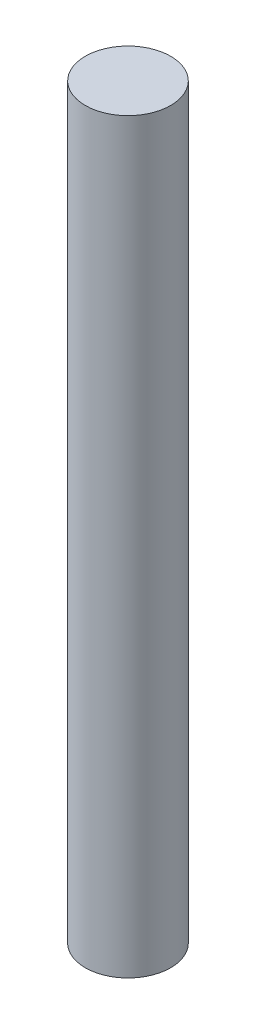
ISO-10303-21;
HEADER;
FILE_DESCRIPTION(('STEP AP214'),'2;1');
FILE_NAME('part.step','',(''),(''),'','','');
FILE_SCHEMA(('AUTOMOTIVE_DESIGN { 1 0 10303 214 1 1 1 1 }'));
ENDSEC;
DATA;
#1=APPLICATION_CONTEXT('core data for automotive mechanical design processes');
#2=APPLICATION_PROTOCOL_DEFINITION('international standard','automotive_design',2000,#1);
#3=PRODUCT_CONTEXT('',#1,'mechanical');
#4=PRODUCT('Part','Part','',(#3));
#5=PRODUCT_RELATED_PRODUCT_CATEGORY('part','',(#4));
#6=PRODUCT_DEFINITION_FORMATION('','',#4);
#7=PRODUCT_DEFINITION_CONTEXT('part definition',#1,'design');
#8=PRODUCT_DEFINITION('design','',#6,#7);
#9=PRODUCT_DEFINITION_SHAPE('','',#8);
#10=(LENGTH_UNIT() NAMED_UNIT(*) SI_UNIT(.MILLI.,.METRE.));
#11=(NAMED_UNIT(*) PLANE_ANGLE_UNIT() SI_UNIT($,.RADIAN.));
#12=(NAMED_UNIT(*) SI_UNIT($,.STERADIAN.) SOLID_ANGLE_UNIT());
#13=UNCERTAINTY_MEASURE_WITH_UNIT(LENGTH_MEASURE(1.E-05),#10,'distance_accuracy_value','');
#14=(GEOMETRIC_REPRESENTATION_CONTEXT(3) GLOBAL_UNCERTAINTY_ASSIGNED_CONTEXT((#13)) GLOBAL_UNIT_ASSIGNED_CONTEXT((#10,
#11,#12)) REPRESENTATION_CONTEXT('',''));
#15=CARTESIAN_POINT('',(0.,0.,0.));
#16=DIRECTION('',(0.,0.,1.));
#17=DIRECTION('',(1.,0.,0.));
#18=AXIS2_PLACEMENT_3D('',#15,#16,#17);
#19=CARTESIAN_POINT('',(0.,70.,0.));
#20=DIRECTION('',(0.,-1.,0.));
#21=DIRECTION('',(0.,0.,-1.));
#22=AXIS2_PLACEMENT_3D('',#19,#20,#21);
#23=CYLINDRICAL_SURFACE('',#22,4.);
#24=CARTESIAN_POINT('',(0.,70.,0.));
#25=DIRECTION('',(0.,1.,0.));
#26=DIRECTION('',(0.,0.,1.));
#27=AXIS2_PLACEMENT_3D('',#24,#25,#26);
#28=CIRCLE('',#27,4.);
#29=CARTESIAN_POINT('',(0.,70.,4.));
#30=VERTEX_POINT('',#29);
#31=EDGE_CURVE('E10',#30,#30,#28,.T.);
#32=ORIENTED_EDGE('',*,*,#31,.F.);
#33=EDGE_LOOP('',(#32));
#34=FACE_BOUND('',#33,.T.);
#35=CARTESIAN_POINT('',(0.,0.,0.));
#36=DIRECTION('',(0.,1.,0.));
#37=DIRECTION('',(0.,0.,1.));
#38=AXIS2_PLACEMENT_3D('',#35,#36,#37);
#39=CIRCLE('',#38,4.);
#40=CARTESIAN_POINT('',(0.,0.,4.));
#41=VERTEX_POINT('',#40);
#42=EDGE_CURVE('E36',#41,#41,#39,.T.);
#43=ORIENTED_EDGE('',*,*,#42,.T.);
#44=EDGE_LOOP('',(#43));
#45=FACE_BOUND('',#44,.T.);
#46=ADVANCED_FACE('F33',(#34,#45),#23,.T.);
#47=CARTESIAN_POINT('',(0.,70.,0.));
#48=DIRECTION('',(0.,1.,0.));
#49=DIRECTION('',(0.,0.,1.));
#50=AXIS2_PLACEMENT_3D('',#47,#48,#49);
#51=PLANE('',#50);
#52=ORIENTED_EDGE('',*,*,#31,.T.);
#53=EDGE_LOOP('',(#52));
#54=FACE_BOUND('',#53,.T.);
#55=ADVANCED_FACE('F48',(#54),#51,.T.);
#56=CARTESIAN_POINT('',(0.,0.,0.));
#57=DIRECTION('',(0.,1.,0.));
#58=DIRECTION('',(0.,0.,1.));
#59=AXIS2_PLACEMENT_3D('',#56,#57,#58);
#60=PLANE('',#59);
#61=ORIENTED_EDGE('',*,*,#42,.F.);
#62=EDGE_LOOP('',(#61));
#63=FACE_BOUND('',#62,.T.);
#64=ADVANCED_FACE('F46',(#63),#60,.F.);
#65=CLOSED_SHELL('',(#46,#55,#64));
#66=MANIFOLD_SOLID_BREP('B2',#65);
#67=ADVANCED_BREP_SHAPE_REPRESENTATION('',(#18,#66),#14);
#68=SHAPE_DEFINITION_REPRESENTATION(#9,#67);
ENDSEC;
END-ISO-10303-21;
